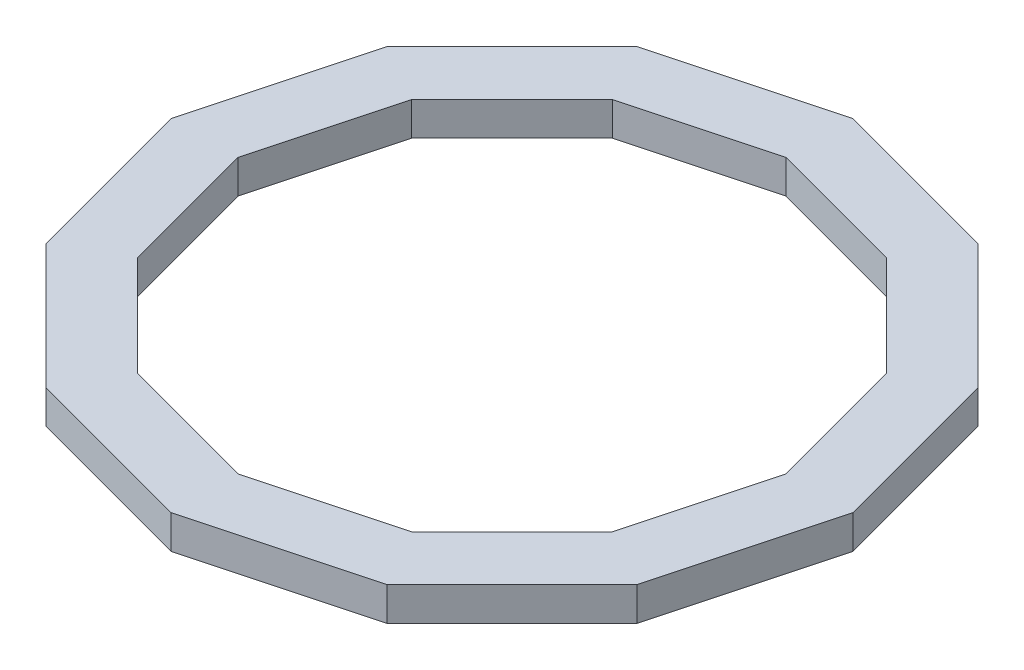
ISO-10303-21;
HEADER;
FILE_DESCRIPTION(('STEP AP214'),'2;1');
FILE_NAME('part.step','',(''),(''),'','','');
FILE_SCHEMA(('AUTOMOTIVE_DESIGN { 1 0 10303 214 1 1 1 1 }'));
ENDSEC;
DATA;
#1=APPLICATION_CONTEXT('core data for automotive mechanical design processes');
#2=APPLICATION_PROTOCOL_DEFINITION('international standard','automotive_design',2000,#1);
#3=PRODUCT_CONTEXT('',#1,'mechanical');
#4=PRODUCT('Part','Part','',(#3));
#5=PRODUCT_RELATED_PRODUCT_CATEGORY('part','',(#4));
#6=PRODUCT_DEFINITION_FORMATION('','',#4);
#7=PRODUCT_DEFINITION_CONTEXT('part definition',#1,'design');
#8=PRODUCT_DEFINITION('design','',#6,#7);
#9=PRODUCT_DEFINITION_SHAPE('','',#8);
#10=(LENGTH_UNIT() NAMED_UNIT(*) SI_UNIT(.MILLI.,.METRE.));
#11=(NAMED_UNIT(*) PLANE_ANGLE_UNIT() SI_UNIT($,.RADIAN.));
#12=(NAMED_UNIT(*) SI_UNIT($,.STERADIAN.) SOLID_ANGLE_UNIT());
#13=UNCERTAINTY_MEASURE_WITH_UNIT(LENGTH_MEASURE(1.E-05),#10,'distance_accuracy_value','');
#14=(GEOMETRIC_REPRESENTATION_CONTEXT(3) GLOBAL_UNCERTAINTY_ASSIGNED_CONTEXT((#13)) GLOBAL_UNIT_ASSIGNED_CONTEXT((#10,
#11,#12)) REPRESENTATION_CONTEXT('',''));
#15=CARTESIAN_POINT('',(0.,0.,0.));
#16=DIRECTION('',(0.,0.,1.));
#17=DIRECTION('',(1.,0.,0.));
#18=AXIS2_PLACEMENT_3D('',#15,#16,#17);
#19=CARTESIAN_POINT('',(0.,19.05,0.));
#20=DIRECTION('',(0.,1.,0.));
#21=DIRECTION('',(0.,0.,1.));
#22=AXIS2_PLACEMENT_3D('',#19,#20,#21);
#23=PLANE('',#22);
#24=DIRECTION('',(-0.258819045102521,0.,0.965925826289068));
#25=VECTOR('',#24,1.);
#26=CARTESIAN_POINT('',(-167.855361508028,19.05,-96.9113381515822));
#27=LINE('',#26,#25);
#28=CARTESIAN_POINT('',(-167.855361508028,19.05,-96.9113381515822));
#29=VERTEX_POINT('',#28);
#30=CARTESIAN_POINT('',(-193.822676303164,19.05,0.));
#31=VERTEX_POINT('',#30);
#32=EDGE_CURVE('E290',#29,#31,#27,.T.);
#33=ORIENTED_EDGE('',*,*,#32,.T.);
#34=DIRECTION('',(0.258819045102521,0.,0.965925826289068));
#35=VECTOR('',#34,1.);
#36=CARTESIAN_POINT('',(-193.822676303164,19.05,0.));
#37=LINE('',#36,#35);
#38=CARTESIAN_POINT('',(-167.855361508028,19.05,96.9113381515822));
#39=VERTEX_POINT('',#38);
#40=EDGE_CURVE('E294',#31,#39,#37,.T.);
#41=ORIENTED_EDGE('',*,*,#40,.T.);
#42=DIRECTION('',(0.707106781186547,0.,0.707106781186548));
#43=VECTOR('',#42,1.);
#44=CARTESIAN_POINT('',(-167.855361508028,19.05,96.9113381515822));
#45=LINE('',#44,#43);
#46=CARTESIAN_POINT('',(-96.9113381515822,19.05,167.855361508028));
#47=VERTEX_POINT('',#46);
#48=EDGE_CURVE('E297',#39,#47,#45,.T.);
#49=ORIENTED_EDGE('',*,*,#48,.T.);
#50=DIRECTION('',(0.965925826289068,0.,0.25881904510252));
#51=VECTOR('',#50,1.);
#52=CARTESIAN_POINT('',(-96.9113381515822,19.05,167.855361508028));
#53=LINE('',#52,#51);
#54=CARTESIAN_POINT('',(0.,19.05,193.822676303164));
#55=VERTEX_POINT('',#54);
#56=EDGE_CURVE('E299',#47,#55,#53,.T.);
#57=ORIENTED_EDGE('',*,*,#56,.T.);
#58=DIRECTION('',(0.965925826289068,0.,-0.258819045102521));
#59=VECTOR('',#58,1.);
#60=CARTESIAN_POINT('',(0.,19.05,193.822676303164));
#61=LINE('',#60,#59);
#62=CARTESIAN_POINT('',(96.9113381515822,19.05,167.855361508028));
#63=VERTEX_POINT('',#62);
#64=EDGE_CURVE('E301',#55,#63,#61,.T.);
#65=ORIENTED_EDGE('',*,*,#64,.T.);
#66=DIRECTION('',(0.707106781186547,0.,-0.707106781186548));
#67=VECTOR('',#66,1.);
#68=CARTESIAN_POINT('',(96.9113381515822,19.05,167.855361508028));
#69=LINE('',#68,#67);
#70=CARTESIAN_POINT('',(167.855361508028,19.05,96.9113381515822));
#71=VERTEX_POINT('',#70);
#72=EDGE_CURVE('E303',#63,#71,#69,.T.);
#73=ORIENTED_EDGE('',*,*,#72,.T.);
#74=DIRECTION('',(0.258819045102521,0.,-0.965925826289068));
#75=VECTOR('',#74,1.);
#76=CARTESIAN_POINT('',(167.855361508028,19.05,96.9113381515822));
#77=LINE('',#76,#75);
#78=CARTESIAN_POINT('',(193.822676303164,19.05,0.));
#79=VERTEX_POINT('',#78);
#80=EDGE_CURVE('E305',#71,#79,#77,.T.);
#81=ORIENTED_EDGE('',*,*,#80,.T.);
#82=DIRECTION('',(-0.258819045102521,0.,-0.965925826289068));
#83=VECTOR('',#82,1.);
#84=CARTESIAN_POINT('',(193.822676303164,19.05,0.));
#85=LINE('',#84,#83);
#86=CARTESIAN_POINT('',(167.855361508028,19.05,-96.9113381515821));
#87=VERTEX_POINT('',#86);
#88=EDGE_CURVE('E307',#79,#87,#85,.T.);
#89=ORIENTED_EDGE('',*,*,#88,.T.);
#90=DIRECTION('',(-0.707106781186547,0.,-0.707106781186548));
#91=VECTOR('',#90,1.);
#92=CARTESIAN_POINT('',(167.855361508028,19.05,-96.9113381515821));
#93=LINE('',#92,#91);
#94=CARTESIAN_POINT('',(96.9113381515819,19.05,-167.855361508029));
#95=VERTEX_POINT('',#94);
#96=EDGE_CURVE('E309',#87,#95,#93,.T.);
#97=ORIENTED_EDGE('',*,*,#96,.T.);
#98=DIRECTION('',(-0.965925826289068,0.,-0.258819045102521));
#99=VECTOR('',#98,1.);
#100=CARTESIAN_POINT('',(96.9113381515819,19.05,-167.855361508029));
#101=LINE('',#100,#99);
#102=CARTESIAN_POINT('',(0.,19.05,-193.822676303164));
#103=VERTEX_POINT('',#102);
#104=EDGE_CURVE('E311',#95,#103,#101,.T.);
#105=ORIENTED_EDGE('',*,*,#104,.T.);
#106=DIRECTION('',(-0.965925826289068,0.,0.258819045102521));
#107=VECTOR('',#106,1.);
#108=CARTESIAN_POINT('',(0.,19.05,-193.822676303164));
#109=LINE('',#108,#107);
#110=CARTESIAN_POINT('',(-96.9113381515821,19.05,-167.855361508029));
#111=VERTEX_POINT('',#110);
#112=EDGE_CURVE('E313',#103,#111,#109,.T.);
#113=ORIENTED_EDGE('',*,*,#112,.T.);
#114=DIRECTION('',(-0.707106781186548,0.,0.707106781186547));
#115=VECTOR('',#114,1.);
#116=CARTESIAN_POINT('',(-96.9113381515821,19.05,-167.855361508029));
#117=LINE('',#116,#115);
#118=EDGE_CURVE('E315',#111,#29,#117,.T.);
#119=ORIENTED_EDGE('',*,*,#118,.T.);
#120=EDGE_LOOP('',(#33,#41,#49,#57,#65,#73,#81,#89,#97,#105,#113,#119));
#121=FACE_BOUND('',#120,.T.);
#122=DIRECTION('',(0.25881904510252,0.,0.965925826289068));
#123=VECTOR('',#122,1.);
#124=CARTESIAN_POINT('',(-155.693454578661,19.05,0.));
#125=LINE('',#124,#123);
#126=CARTESIAN_POINT('',(-155.693454578661,19.05,0.));
#127=VERTEX_POINT('',#126);
#128=CARTESIAN_POINT('',(-134.834486868079,19.05,77.8467272893304));
#129=VERTEX_POINT('',#128);
#130=EDGE_CURVE('E204',#127,#129,#125,.T.);
#131=ORIENTED_EDGE('',*,*,#130,.F.);
#132=DIRECTION('',(-0.258819045102521,0.,0.965925826289068));
#133=VECTOR('',#132,1.);
#134=CARTESIAN_POINT('',(-134.834486868079,19.05,-77.8467272893304));
#135=LINE('',#134,#133);
#136=CARTESIAN_POINT('',(-134.834486868079,19.05,-77.8467272893304));
#137=VERTEX_POINT('',#136);
#138=EDGE_CURVE('E196',#137,#127,#135,.T.);
#139=ORIENTED_EDGE('',*,*,#138,.F.);
#140=DIRECTION('',(-0.707106781186548,0.,0.707106781186547));
#141=VECTOR('',#140,1.);
#142=CARTESIAN_POINT('',(-77.8467272893303,19.05,-134.834486868079));
#143=LINE('',#142,#141);
#144=CARTESIAN_POINT('',(-77.8467272893303,19.05,-134.834486868079));
#145=VERTEX_POINT('',#144);
#146=EDGE_CURVE('E237',#145,#137,#143,.T.);
#147=ORIENTED_EDGE('',*,*,#146,.F.);
#148=DIRECTION('',(-0.965925826289068,0.,0.25881904510252));
#149=VECTOR('',#148,1.);
#150=CARTESIAN_POINT('',(1.11608000320187E-13,19.05,-155.693454578661));
#151=LINE('',#150,#149);
#152=CARTESIAN_POINT('',(1.11608000320187E-13,19.05,-155.693454578661));
#153=VERTEX_POINT('',#152);
#154=EDGE_CURVE('E235',#153,#145,#151,.T.);
#155=ORIENTED_EDGE('',*,*,#154,.F.);
#156=DIRECTION('',(-0.965925826289068,0.,-0.258819045102521));
#157=VECTOR('',#156,1.);
#158=CARTESIAN_POINT('',(77.8467272893306,19.05,-134.834486868079));
#159=LINE('',#158,#157);
#160=CARTESIAN_POINT('',(77.8467272893306,19.05,-134.834486868079));
#161=VERTEX_POINT('',#160);
#162=EDGE_CURVE('E233',#161,#153,#159,.T.);
#163=ORIENTED_EDGE('',*,*,#162,.F.);
#164=DIRECTION('',(-0.707106781186547,0.,-0.707106781186548));
#165=VECTOR('',#164,1.);
#166=CARTESIAN_POINT('',(134.834486868079,19.05,-77.8467272893304));
#167=LINE('',#166,#165);
#168=CARTESIAN_POINT('',(134.834486868079,19.05,-77.8467272893304));
#169=VERTEX_POINT('',#168);
#170=EDGE_CURVE('E231',#169,#161,#167,.T.);
#171=ORIENTED_EDGE('',*,*,#170,.F.);
#172=DIRECTION('',(-0.258819045102521,0.,-0.965925826289068));
#173=VECTOR('',#172,1.);
#174=CARTESIAN_POINT('',(155.693454578661,19.05,1.72477816094025E-13));
#175=LINE('',#174,#173);
#176=CARTESIAN_POINT('',(155.693454578661,19.05,1.72477816094025E-13));
#177=VERTEX_POINT('',#176);
#178=EDGE_CURVE('E229',#177,#169,#175,.T.);
#179=ORIENTED_EDGE('',*,*,#178,.F.);
#180=DIRECTION('',(0.258819045102522,0.,-0.965925826289068));
#181=VECTOR('',#180,1.);
#182=CARTESIAN_POINT('',(134.834486868079,19.05,77.8467272893304));
#183=LINE('',#182,#181);
#184=CARTESIAN_POINT('',(134.834486868079,19.05,77.8467272893304));
#185=VERTEX_POINT('',#184);
#186=EDGE_CURVE('E227',#185,#177,#183,.T.);
#187=ORIENTED_EDGE('',*,*,#186,.F.);
#188=DIRECTION('',(0.707106781186548,0.,-0.707106781186547));
#189=VECTOR('',#188,1.);
#190=CARTESIAN_POINT('',(77.8467272893305,19.05,134.834486868079));
#191=LINE('',#190,#189);
#192=CARTESIAN_POINT('',(77.8467272893305,19.05,134.834486868079));
#193=VERTEX_POINT('',#192);
#194=EDGE_CURVE('E225',#193,#185,#191,.T.);
#195=ORIENTED_EDGE('',*,*,#194,.F.);
#196=DIRECTION('',(0.965925826289068,0.,-0.258819045102521));
#197=VECTOR('',#196,1.);
#198=CARTESIAN_POINT('',(-1.22547225990368E-13,19.05,155.693454578661));
#199=LINE('',#198,#197);
#200=CARTESIAN_POINT('',(-1.22547225990368E-13,19.05,155.693454578661));
#201=VERTEX_POINT('',#200);
#202=EDGE_CURVE('E223',#201,#193,#199,.T.);
#203=ORIENTED_EDGE('',*,*,#202,.F.);
#204=DIRECTION('',(0.965925826289068,0.,0.258819045102521));
#205=VECTOR('',#204,1.);
#206=CARTESIAN_POINT('',(-77.8467272893304,19.05,134.834486868079));
#207=LINE('',#206,#205);
#208=CARTESIAN_POINT('',(-77.8467272893304,19.05,134.834486868079));
#209=VERTEX_POINT('',#208);
#210=EDGE_CURVE('E219',#209,#201,#207,.T.);
#211=ORIENTED_EDGE('',*,*,#210,.F.);
#212=DIRECTION('',(0.707106781186547,0.,0.707106781186548));
#213=VECTOR('',#212,1.);
#214=CARTESIAN_POINT('',(-134.834486868079,19.05,77.8467272893304));
#215=LINE('',#214,#213);
#216=EDGE_CURVE('E217',#129,#209,#215,.T.);
#217=ORIENTED_EDGE('',*,*,#216,.F.);
#218=EDGE_LOOP('',(#131,#139,#147,#155,#163,#171,#179,#187,#195,#203,#211,#217));
#219=FACE_BOUND('',#218,.T.);
#220=ADVANCED_FACE('F35',(#121,#219),#23,.T.);
#221=CARTESIAN_POINT('',(0.,0.,0.));
#222=DIRECTION('',(0.,1.,0.));
#223=DIRECTION('',(0.,0.,1.));
#224=AXIS2_PLACEMENT_3D('',#221,#222,#223);
#225=PLANE('',#224);
#226=DIRECTION('',(-0.258819045102521,0.,0.965925826289068));
#227=VECTOR('',#226,1.);
#228=CARTESIAN_POINT('',(-167.855361508028,0.,-96.9113381515822));
#229=LINE('',#228,#227);
#230=CARTESIAN_POINT('',(-167.855361508028,0.,-96.9113381515822));
#231=VERTEX_POINT('',#230);
#232=CARTESIAN_POINT('',(-193.822676303164,0.,0.));
#233=VERTEX_POINT('',#232);
#234=EDGE_CURVE('E212',#231,#233,#229,.T.);
#235=ORIENTED_EDGE('',*,*,#234,.F.);
#236=DIRECTION('',(-0.707106781186548,0.,0.707106781186547));
#237=VECTOR('',#236,1.);
#238=CARTESIAN_POINT('',(-96.9113381515821,0.,-167.855361508029));
#239=LINE('',#238,#237);
#240=CARTESIAN_POINT('',(-96.9113381515821,0.,-167.855361508029));
#241=VERTEX_POINT('',#240);
#242=EDGE_CURVE('E295',#241,#231,#239,.T.);
#243=ORIENTED_EDGE('',*,*,#242,.F.);
#244=DIRECTION('',(-0.965925826289068,0.,0.258819045102521));
#245=VECTOR('',#244,1.);
#246=CARTESIAN_POINT('',(0.,0.,-193.822676303164));
#247=LINE('',#246,#245);
#248=CARTESIAN_POINT('',(0.,0.,-193.822676303164));
#249=VERTEX_POINT('',#248);
#250=EDGE_CURVE('E339',#249,#241,#247,.T.);
#251=ORIENTED_EDGE('',*,*,#250,.F.);
#252=DIRECTION('',(-0.965925826289068,0.,-0.258819045102521));
#253=VECTOR('',#252,1.);
#254=CARTESIAN_POINT('',(96.9113381515819,0.,-167.855361508029));
#255=LINE('',#254,#253);
#256=CARTESIAN_POINT('',(96.9113381515819,0.,-167.855361508029));
#257=VERTEX_POINT('',#256);
#258=EDGE_CURVE('E337',#257,#249,#255,.T.);
#259=ORIENTED_EDGE('',*,*,#258,.F.);
#260=DIRECTION('',(-0.707106781186547,0.,-0.707106781186548));
#261=VECTOR('',#260,1.);
#262=CARTESIAN_POINT('',(167.855361508028,0.,-96.9113381515821));
#263=LINE('',#262,#261);
#264=CARTESIAN_POINT('',(167.855361508028,0.,-96.9113381515821));
#265=VERTEX_POINT('',#264);
#266=EDGE_CURVE('E335',#265,#257,#263,.T.);
#267=ORIENTED_EDGE('',*,*,#266,.F.);
#268=DIRECTION('',(-0.258819045102521,0.,-0.965925826289068));
#269=VECTOR('',#268,1.);
#270=CARTESIAN_POINT('',(193.822676303164,0.,0.));
#271=LINE('',#270,#269);
#272=CARTESIAN_POINT('',(193.822676303164,0.,0.));
#273=VERTEX_POINT('',#272);
#274=EDGE_CURVE('E333',#273,#265,#271,.T.);
#275=ORIENTED_EDGE('',*,*,#274,.F.);
#276=DIRECTION('',(0.258819045102521,0.,-0.965925826289068));
#277=VECTOR('',#276,1.);
#278=CARTESIAN_POINT('',(167.855361508028,0.,96.9113381515822));
#279=LINE('',#278,#277);
#280=CARTESIAN_POINT('',(167.855361508028,0.,96.9113381515822));
#281=VERTEX_POINT('',#280);
#282=EDGE_CURVE('E331',#281,#273,#279,.T.);
#283=ORIENTED_EDGE('',*,*,#282,.F.);
#284=DIRECTION('',(0.707106781186547,0.,-0.707106781186548));
#285=VECTOR('',#284,1.);
#286=CARTESIAN_POINT('',(96.9113381515822,0.,167.855361508028));
#287=LINE('',#286,#285);
#288=CARTESIAN_POINT('',(96.9113381515822,0.,167.855361508028));
#289=VERTEX_POINT('',#288);
#290=EDGE_CURVE('E329',#289,#281,#287,.T.);
#291=ORIENTED_EDGE('',*,*,#290,.F.);
#292=DIRECTION('',(0.965925826289068,0.,-0.258819045102521));
#293=VECTOR('',#292,1.);
#294=CARTESIAN_POINT('',(0.,0.,193.822676303164));
#295=LINE('',#294,#293);
#296=CARTESIAN_POINT('',(0.,0.,193.822676303164));
#297=VERTEX_POINT('',#296);
#298=EDGE_CURVE('E327',#297,#289,#295,.T.);
#299=ORIENTED_EDGE('',*,*,#298,.F.);
#300=DIRECTION('',(0.965925826289068,0.,0.25881904510252));
#301=VECTOR('',#300,1.);
#302=CARTESIAN_POINT('',(-96.9113381515822,0.,167.855361508028));
#303=LINE('',#302,#301);
#304=CARTESIAN_POINT('',(-96.9113381515822,0.,167.855361508028));
#305=VERTEX_POINT('',#304);
#306=EDGE_CURVE('E325',#305,#297,#303,.T.);
#307=ORIENTED_EDGE('',*,*,#306,.F.);
#308=DIRECTION('',(0.707106781186547,0.,0.707106781186548));
#309=VECTOR('',#308,1.);
#310=CARTESIAN_POINT('',(-167.855361508028,0.,96.9113381515822));
#311=LINE('',#310,#309);
#312=CARTESIAN_POINT('',(-167.855361508028,0.,96.9113381515822));
#313=VERTEX_POINT('',#312);
#314=EDGE_CURVE('E323',#313,#305,#311,.T.);
#315=ORIENTED_EDGE('',*,*,#314,.F.);
#316=DIRECTION('',(0.258819045102521,0.,0.965925826289068));
#317=VECTOR('',#316,1.);
#318=CARTESIAN_POINT('',(-193.822676303164,0.,0.));
#319=LINE('',#318,#317);
#320=EDGE_CURVE('E321',#233,#313,#319,.T.);
#321=ORIENTED_EDGE('',*,*,#320,.F.);
#322=EDGE_LOOP('',(#235,#243,#251,#259,#267,#275,#283,#291,#299,#307,#315,#321));
#323=FACE_BOUND('',#322,.T.);
#324=DIRECTION('',(-0.258819045102521,0.,0.965925826289068));
#325=VECTOR('',#324,1.);
#326=CARTESIAN_POINT('',(-134.834486868079,0.,-77.8467272893304));
#327=LINE('',#326,#325);
#328=CARTESIAN_POINT('',(-134.834486868079,0.,-77.8467272893304));
#329=VERTEX_POINT('',#328);
#330=CARTESIAN_POINT('',(-155.693454578661,0.,0.));
#331=VERTEX_POINT('',#330);
#332=EDGE_CURVE('E58',#329,#331,#327,.T.);
#333=ORIENTED_EDGE('',*,*,#332,.T.);
#334=DIRECTION('',(0.25881904510252,0.,0.965925826289068));
#335=VECTOR('',#334,1.);
#336=CARTESIAN_POINT('',(-155.693454578661,0.,0.));
#337=LINE('',#336,#335);
#338=CARTESIAN_POINT('',(-134.834486868079,0.,77.8467272893304));
#339=VERTEX_POINT('',#338);
#340=EDGE_CURVE('E211',#331,#339,#337,.T.);
#341=ORIENTED_EDGE('',*,*,#340,.T.);
#342=DIRECTION('',(0.707106781186547,0.,0.707106781186548));
#343=VECTOR('',#342,1.);
#344=CARTESIAN_POINT('',(-134.834486868079,0.,77.8467272893304));
#345=LINE('',#344,#343);
#346=CARTESIAN_POINT('',(-77.8467272893304,0.,134.834486868079));
#347=VERTEX_POINT('',#346);
#348=EDGE_CURVE('E241',#339,#347,#345,.T.);
#349=ORIENTED_EDGE('',*,*,#348,.T.);
#350=DIRECTION('',(0.965925826289068,0.,0.258819045102521));
#351=VECTOR('',#350,1.);
#352=CARTESIAN_POINT('',(-77.8467272893304,0.,134.834486868079));
#353=LINE('',#352,#351);
#354=CARTESIAN_POINT('',(-1.22547225990368E-13,0.,155.693454578661));
#355=VERTEX_POINT('',#354);
#356=EDGE_CURVE('E244',#347,#355,#353,.T.);
#357=ORIENTED_EDGE('',*,*,#356,.T.);
#358=DIRECTION('',(0.965925826289068,0.,-0.258819045102521));
#359=VECTOR('',#358,1.);
#360=CARTESIAN_POINT('',(-1.22547225990368E-13,0.,155.693454578661));
#361=LINE('',#360,#359);
#362=CARTESIAN_POINT('',(77.8467272893305,0.,134.834486868079));
#363=VERTEX_POINT('',#362);
#364=EDGE_CURVE('E247',#355,#363,#361,.T.);
#365=ORIENTED_EDGE('',*,*,#364,.T.);
#366=DIRECTION('',(0.707106781186548,0.,-0.707106781186547));
#367=VECTOR('',#366,1.);
#368=CARTESIAN_POINT('',(77.8467272893305,0.,134.834486868079));
#369=LINE('',#368,#367);
#370=CARTESIAN_POINT('',(134.834486868079,0.,77.8467272893304));
#371=VERTEX_POINT('',#370);
#372=EDGE_CURVE('E250',#363,#371,#369,.T.);
#373=ORIENTED_EDGE('',*,*,#372,.T.);
#374=DIRECTION('',(0.258819045102522,0.,-0.965925826289068));
#375=VECTOR('',#374,1.);
#376=CARTESIAN_POINT('',(134.834486868079,0.,77.8467272893304));
#377=LINE('',#376,#375);
#378=CARTESIAN_POINT('',(155.693454578661,0.,1.72477816094025E-13));
#379=VERTEX_POINT('',#378);
#380=EDGE_CURVE('E253',#371,#379,#377,.T.);
#381=ORIENTED_EDGE('',*,*,#380,.T.);
#382=DIRECTION('',(-0.258819045102521,0.,-0.965925826289068));
#383=VECTOR('',#382,1.);
#384=CARTESIAN_POINT('',(155.693454578661,0.,1.72477816094025E-13));
#385=LINE('',#384,#383);
#386=CARTESIAN_POINT('',(134.834486868079,0.,-77.8467272893304));
#387=VERTEX_POINT('',#386);
#388=EDGE_CURVE('E256',#379,#387,#385,.T.);
#389=ORIENTED_EDGE('',*,*,#388,.T.);
#390=DIRECTION('',(-0.707106781186547,0.,-0.707106781186548));
#391=VECTOR('',#390,1.);
#392=CARTESIAN_POINT('',(134.834486868079,0.,-77.8467272893304));
#393=LINE('',#392,#391);
#394=CARTESIAN_POINT('',(77.8467272893306,0.,-134.834486868079));
#395=VERTEX_POINT('',#394);
#396=EDGE_CURVE('E259',#387,#395,#393,.T.);
#397=ORIENTED_EDGE('',*,*,#396,.T.);
#398=DIRECTION('',(-0.965925826289068,0.,-0.258819045102521));
#399=VECTOR('',#398,1.);
#400=CARTESIAN_POINT('',(77.8467272893306,0.,-134.834486868079));
#401=LINE('',#400,#399);
#402=CARTESIAN_POINT('',(1.11608000320187E-13,0.,-155.693454578661));
#403=VERTEX_POINT('',#402);
#404=EDGE_CURVE('E262',#395,#403,#401,.T.);
#405=ORIENTED_EDGE('',*,*,#404,.T.);
#406=DIRECTION('',(-0.965925826289068,0.,0.25881904510252));
#407=VECTOR('',#406,1.);
#408=CARTESIAN_POINT('',(1.11608000320187E-13,0.,-155.693454578661));
#409=LINE('',#408,#407);
#410=CARTESIAN_POINT('',(-77.8467272893303,0.,-134.834486868079));
#411=VERTEX_POINT('',#410);
#412=EDGE_CURVE('E265',#403,#411,#409,.T.);
#413=ORIENTED_EDGE('',*,*,#412,.T.);
#414=DIRECTION('',(-0.707106781186548,0.,0.707106781186547));
#415=VECTOR('',#414,1.);
#416=CARTESIAN_POINT('',(-77.8467272893303,0.,-134.834486868079));
#417=LINE('',#416,#415);
#418=EDGE_CURVE('E205',#411,#329,#417,.T.);
#419=ORIENTED_EDGE('',*,*,#418,.T.);
#420=EDGE_LOOP('',(#333,#341,#349,#357,#365,#373,#381,#389,#397,#405,#413,#419));
#421=FACE_BOUND('',#420,.T.);
#422=ADVANCED_FACE('F382',(#323,#421),#225,.F.);
#423=CARTESIAN_POINT('',(-167.855361508028,19.05,-96.9113381515822));
#424=DIRECTION('',(0.965925826289068,0.,0.258819045102521));
#425=DIRECTION('',(0.258819045102521,0.,-0.965925826289068));
#426=AXIS2_PLACEMENT_3D('',#423,#424,#425);
#427=PLANE('',#426);
#428=ORIENTED_EDGE('',*,*,#234,.T.);
#429=DIRECTION('',(0.,-1.,0.));
#430=VECTOR('',#429,1.);
#431=CARTESIAN_POINT('',(-193.822676303164,19.05,0.));
#432=LINE('',#431,#430);
#433=EDGE_CURVE('E11',#31,#233,#432,.T.);
#434=ORIENTED_EDGE('',*,*,#433,.F.);
#435=ORIENTED_EDGE('',*,*,#32,.F.);
#436=DIRECTION('',(0.,-1.,0.));
#437=VECTOR('',#436,1.);
#438=CARTESIAN_POINT('',(-167.855361508028,19.05,-96.9113381515822));
#439=LINE('',#438,#437);
#440=EDGE_CURVE('E317',#29,#231,#439,.T.);
#441=ORIENTED_EDGE('',*,*,#440,.T.);
#442=EDGE_LOOP('',(#428,#434,#435,#441));
#443=FACE_BOUND('',#442,.T.);
#444=ADVANCED_FACE('F37',(#443),#427,.F.);
#445=CARTESIAN_POINT('',(-193.822676303164,19.05,0.));
#446=DIRECTION('',(0.965925826289068,0.,-0.258819045102521));
#447=DIRECTION('',(-0.258819045102521,0.,-0.965925826289068));
#448=AXIS2_PLACEMENT_3D('',#445,#446,#447);
#449=PLANE('',#448);
#450=ORIENTED_EDGE('',*,*,#320,.T.);
#451=DIRECTION('',(0.,-1.,0.));
#452=VECTOR('',#451,1.);
#453=CARTESIAN_POINT('',(-167.855361508028,19.05,96.9113381515822));
#454=LINE('',#453,#452);
#455=EDGE_CURVE('E43',#39,#313,#454,.T.);
#456=ORIENTED_EDGE('',*,*,#455,.F.);
#457=ORIENTED_EDGE('',*,*,#40,.F.);
#458=ORIENTED_EDGE('',*,*,#433,.T.);
#459=EDGE_LOOP('',(#450,#456,#457,#458));
#460=FACE_BOUND('',#459,.T.);
#461=ADVANCED_FACE('F399',(#460),#449,.F.);
#462=CARTESIAN_POINT('',(-167.855361508028,19.05,96.9113381515822));
#463=DIRECTION('',(0.707106781186548,0.,-0.707106781186547));
#464=DIRECTION('',(-0.707106781186547,0.,-0.707106781186548));
#465=AXIS2_PLACEMENT_3D('',#462,#463,#464);
#466=PLANE('',#465);
#467=ORIENTED_EDGE('',*,*,#314,.T.);
#468=DIRECTION('',(0.,-1.,0.));
#469=VECTOR('',#468,1.);
#470=CARTESIAN_POINT('',(-96.9113381515822,19.05,167.855361508028));
#471=LINE('',#470,#469);
#472=EDGE_CURVE('E369',#47,#305,#471,.T.);
#473=ORIENTED_EDGE('',*,*,#472,.F.);
#474=ORIENTED_EDGE('',*,*,#48,.F.);
#475=ORIENTED_EDGE('',*,*,#455,.T.);
#476=EDGE_LOOP('',(#467,#473,#474,#475));
#477=FACE_BOUND('',#476,.T.);
#478=ADVANCED_FACE('F376',(#477),#466,.F.);
#479=CARTESIAN_POINT('',(-96.9113381515822,19.05,167.855361508028));
#480=DIRECTION('',(0.25881904510252,0.,-0.965925826289068));
#481=DIRECTION('',(-0.965925826289069,0.,-0.25881904510252));
#482=AXIS2_PLACEMENT_3D('',#479,#480,#481);
#483=PLANE('',#482);
#484=ORIENTED_EDGE('',*,*,#306,.T.);
#485=DIRECTION('',(0.,-1.,0.));
#486=VECTOR('',#485,1.);
#487=CARTESIAN_POINT('',(0.,19.05,193.822676303164));
#488=LINE('',#487,#486);
#489=EDGE_CURVE('E366',#55,#297,#488,.T.);
#490=ORIENTED_EDGE('',*,*,#489,.F.);
#491=ORIENTED_EDGE('',*,*,#56,.F.);
#492=ORIENTED_EDGE('',*,*,#472,.T.);
#493=EDGE_LOOP('',(#484,#490,#491,#492));
#494=FACE_BOUND('',#493,.T.);
#495=ADVANCED_FACE('F388',(#494),#483,.F.);
#496=CARTESIAN_POINT('',(0.,19.05,193.822676303164));
#497=DIRECTION('',(-0.258819045102521,0.,-0.965925826289068));
#498=DIRECTION('',(-0.965925826289068,0.,0.258819045102521));
#499=AXIS2_PLACEMENT_3D('',#496,#497,#498);
#500=PLANE('',#499);
#501=ORIENTED_EDGE('',*,*,#298,.T.);
#502=DIRECTION('',(0.,-1.,0.));
#503=VECTOR('',#502,1.);
#504=CARTESIAN_POINT('',(96.9113381515822,19.05,167.855361508028));
#505=LINE('',#504,#503);
#506=EDGE_CURVE('E363',#63,#289,#505,.T.);
#507=ORIENTED_EDGE('',*,*,#506,.F.);
#508=ORIENTED_EDGE('',*,*,#64,.F.);
#509=ORIENTED_EDGE('',*,*,#489,.T.);
#510=EDGE_LOOP('',(#501,#507,#508,#509));
#511=FACE_BOUND('',#510,.T.);
#512=ADVANCED_FACE('F392',(#511),#500,.F.);
#513=CARTESIAN_POINT('',(96.9113381515822,19.05,167.855361508028));
#514=DIRECTION('',(-0.707106781186548,0.,-0.707106781186547));
#515=DIRECTION('',(-0.707106781186547,0.,0.707106781186548));
#516=AXIS2_PLACEMENT_3D('',#513,#514,#515);
#517=PLANE('',#516);
#518=ORIENTED_EDGE('',*,*,#290,.T.);
#519=DIRECTION('',(0.,-1.,0.));
#520=VECTOR('',#519,1.);
#521=CARTESIAN_POINT('',(167.855361508028,19.05,96.9113381515822));
#522=LINE('',#521,#520);
#523=EDGE_CURVE('E360',#71,#281,#522,.T.);
#524=ORIENTED_EDGE('',*,*,#523,.F.);
#525=ORIENTED_EDGE('',*,*,#72,.F.);
#526=ORIENTED_EDGE('',*,*,#506,.T.);
#527=EDGE_LOOP('',(#518,#524,#525,#526));
#528=FACE_BOUND('',#527,.T.);
#529=ADVANCED_FACE('F432',(#528),#517,.F.);
#530=CARTESIAN_POINT('',(167.855361508028,19.05,96.9113381515822));
#531=DIRECTION('',(-0.965925826289068,0.,-0.258819045102521));
#532=DIRECTION('',(-0.258819045102521,0.,0.965925826289068));
#533=AXIS2_PLACEMENT_3D('',#530,#531,#532);
#534=PLANE('',#533);
#535=ORIENTED_EDGE('',*,*,#282,.T.);
#536=DIRECTION('',(0.,-1.,0.));
#537=VECTOR('',#536,1.);
#538=CARTESIAN_POINT('',(193.822676303164,19.05,0.));
#539=LINE('',#538,#537);
#540=EDGE_CURVE('E357',#79,#273,#539,.T.);
#541=ORIENTED_EDGE('',*,*,#540,.F.);
#542=ORIENTED_EDGE('',*,*,#80,.F.);
#543=ORIENTED_EDGE('',*,*,#523,.T.);
#544=EDGE_LOOP('',(#535,#541,#542,#543));
#545=FACE_BOUND('',#544,.T.);
#546=ADVANCED_FACE('F430',(#545),#534,.F.);
#547=CARTESIAN_POINT('',(193.822676303164,19.05,0.));
#548=DIRECTION('',(-0.965925826289068,0.,0.258819045102521));
#549=DIRECTION('',(0.258819045102521,0.,0.965925826289068));
#550=AXIS2_PLACEMENT_3D('',#547,#548,#549);
#551=PLANE('',#550);
#552=ORIENTED_EDGE('',*,*,#274,.T.);
#553=DIRECTION('',(0.,-1.,0.));
#554=VECTOR('',#553,1.);
#555=CARTESIAN_POINT('',(167.855361508028,19.05,-96.9113381515821));
#556=LINE('',#555,#554);
#557=EDGE_CURVE('E354',#87,#265,#556,.T.);
#558=ORIENTED_EDGE('',*,*,#557,.F.);
#559=ORIENTED_EDGE('',*,*,#88,.F.);
#560=ORIENTED_EDGE('',*,*,#540,.T.);
#561=EDGE_LOOP('',(#552,#558,#559,#560));
#562=FACE_BOUND('',#561,.T.);
#563=ADVANCED_FACE('F426',(#562),#551,.F.);
#564=CARTESIAN_POINT('',(167.855361508028,19.05,-96.9113381515821));
#565=DIRECTION('',(-0.707106781186548,0.,0.707106781186547));
#566=DIRECTION('',(0.707106781186547,0.,0.707106781186548));
#567=AXIS2_PLACEMENT_3D('',#564,#565,#566);
#568=PLANE('',#567);
#569=ORIENTED_EDGE('',*,*,#266,.T.);
#570=DIRECTION('',(0.,-1.,0.));
#571=VECTOR('',#570,1.);
#572=CARTESIAN_POINT('',(96.9113381515819,19.05,-167.855361508029));
#573=LINE('',#572,#571);
#574=EDGE_CURVE('E350',#95,#257,#573,.T.);
#575=ORIENTED_EDGE('',*,*,#574,.F.);
#576=ORIENTED_EDGE('',*,*,#96,.F.);
#577=ORIENTED_EDGE('',*,*,#557,.T.);
#578=EDGE_LOOP('',(#569,#575,#576,#577));
#579=FACE_BOUND('',#578,.T.);
#580=ADVANCED_FACE('F421',(#579),#568,.F.);
#581=CARTESIAN_POINT('',(96.9113381515819,19.05,-167.855361508029));
#582=DIRECTION('',(-0.258819045102521,0.,0.965925826289068));
#583=DIRECTION('',(0.965925826289068,0.,0.258819045102521));
#584=AXIS2_PLACEMENT_3D('',#581,#582,#583);
#585=PLANE('',#584);
#586=ORIENTED_EDGE('',*,*,#258,.T.);
#587=DIRECTION('',(0.,-1.,0.));
#588=VECTOR('',#587,1.);
#589=CARTESIAN_POINT('',(0.,19.05,-193.822676303164));
#590=LINE('',#589,#588);
#591=EDGE_CURVE('E347',#103,#249,#590,.T.);
#592=ORIENTED_EDGE('',*,*,#591,.F.);
#593=ORIENTED_EDGE('',*,*,#104,.F.);
#594=ORIENTED_EDGE('',*,*,#574,.T.);
#595=EDGE_LOOP('',(#586,#592,#593,#594));
#596=FACE_BOUND('',#595,.T.);
#597=ADVANCED_FACE('F415',(#596),#585,.F.);
#598=CARTESIAN_POINT('',(0.,19.05,-193.822676303164));
#599=DIRECTION('',(0.258819045102521,0.,0.965925826289068));
#600=DIRECTION('',(0.965925826289068,0.,-0.258819045102521));
#601=AXIS2_PLACEMENT_3D('',#598,#599,#600);
#602=PLANE('',#601);
#603=ORIENTED_EDGE('',*,*,#250,.T.);
#604=DIRECTION('',(0.,-1.,0.));
#605=VECTOR('',#604,1.);
#606=CARTESIAN_POINT('',(-96.9113381515821,19.05,-167.855361508029));
#607=LINE('',#606,#605);
#608=EDGE_CURVE('E344',#111,#241,#607,.T.);
#609=ORIENTED_EDGE('',*,*,#608,.F.);
#610=ORIENTED_EDGE('',*,*,#112,.F.);
#611=ORIENTED_EDGE('',*,*,#591,.T.);
#612=EDGE_LOOP('',(#603,#609,#610,#611));
#613=FACE_BOUND('',#612,.T.);
#614=ADVANCED_FACE('F411',(#613),#602,.F.);
#615=CARTESIAN_POINT('',(-96.9113381515821,19.05,-167.855361508029));
#616=DIRECTION('',(0.707106781186547,0.,0.707106781186548));
#617=DIRECTION('',(0.707106781186548,0.,-0.707106781186547));
#618=AXIS2_PLACEMENT_3D('',#615,#616,#617);
#619=PLANE('',#618);
#620=ORIENTED_EDGE('',*,*,#242,.T.);
#621=ORIENTED_EDGE('',*,*,#440,.F.);
#622=ORIENTED_EDGE('',*,*,#118,.F.);
#623=ORIENTED_EDGE('',*,*,#608,.T.);
#624=EDGE_LOOP('',(#620,#621,#622,#623));
#625=FACE_BOUND('',#624,.T.);
#626=ADVANCED_FACE('F406',(#625),#619,.F.);
#627=CARTESIAN_POINT('',(-134.834486868079,19.05,-77.8467272893304));
#628=DIRECTION('',(0.965925826289068,0.,0.258819045102521));
#629=DIRECTION('',(0.258819045102521,0.,-0.965925826289068));
#630=AXIS2_PLACEMENT_3D('',#627,#628,#629);
#631=PLANE('',#630);
#632=ORIENTED_EDGE('',*,*,#332,.F.);
#633=DIRECTION('',(0.,-1.,0.));
#634=VECTOR('',#633,1.);
#635=CARTESIAN_POINT('',(-134.834486868079,19.05,-77.8467272893304));
#636=LINE('',#635,#634);
#637=EDGE_CURVE('E200',#137,#329,#636,.T.);
#638=ORIENTED_EDGE('',*,*,#637,.F.);
#639=ORIENTED_EDGE('',*,*,#138,.T.);
#640=DIRECTION('',(0.,-1.,0.));
#641=VECTOR('',#640,1.);
#642=CARTESIAN_POINT('',(-155.693454578661,19.05,0.));
#643=LINE('',#642,#641);
#644=EDGE_CURVE('E199',#127,#331,#643,.T.);
#645=ORIENTED_EDGE('',*,*,#644,.T.);
#646=EDGE_LOOP('',(#632,#638,#639,#645));
#647=FACE_BOUND('',#646,.T.);
#648=ADVANCED_FACE('F198',(#647),#631,.T.);
#649=CARTESIAN_POINT('',(-155.693454578661,19.05,0.));
#650=DIRECTION('',(0.965925826289068,0.,-0.25881904510252));
#651=DIRECTION('',(-0.25881904510252,0.,-0.965925826289068));
#652=AXIS2_PLACEMENT_3D('',#649,#650,#651);
#653=PLANE('',#652);
#654=ORIENTED_EDGE('',*,*,#340,.F.);
#655=ORIENTED_EDGE('',*,*,#644,.F.);
#656=ORIENTED_EDGE('',*,*,#130,.T.);
#657=DIRECTION('',(0.,-1.,0.));
#658=VECTOR('',#657,1.);
#659=CARTESIAN_POINT('',(-134.834486868079,19.05,77.8467272893304));
#660=LINE('',#659,#658);
#661=EDGE_CURVE('E213',#129,#339,#660,.T.);
#662=ORIENTED_EDGE('',*,*,#661,.T.);
#663=EDGE_LOOP('',(#654,#655,#656,#662));
#664=FACE_BOUND('',#663,.T.);
#665=ADVANCED_FACE('F208',(#664),#653,.T.);
#666=CARTESIAN_POINT('',(-134.834486868079,19.05,77.8467272893304));
#667=DIRECTION('',(0.707106781186548,0.,-0.707106781186547));
#668=DIRECTION('',(-0.707106781186547,0.,-0.707106781186548));
#669=AXIS2_PLACEMENT_3D('',#666,#667,#668);
#670=PLANE('',#669);
#671=ORIENTED_EDGE('',*,*,#348,.F.);
#672=ORIENTED_EDGE('',*,*,#661,.F.);
#673=ORIENTED_EDGE('',*,*,#216,.T.);
#674=DIRECTION('',(0.,-1.,0.));
#675=VECTOR('',#674,1.);
#676=CARTESIAN_POINT('',(-77.8467272893304,19.05,134.834486868079));
#677=LINE('',#676,#675);
#678=EDGE_CURVE('E287',#209,#347,#677,.T.);
#679=ORIENTED_EDGE('',*,*,#678,.T.);
#680=EDGE_LOOP('',(#671,#672,#673,#679));
#681=FACE_BOUND('',#680,.T.);
#682=ADVANCED_FACE('F490',(#681),#670,.T.);
#683=CARTESIAN_POINT('',(-77.8467272893304,19.05,134.834486868079));
#684=DIRECTION('',(0.258819045102521,0.,-0.965925826289068));
#685=DIRECTION('',(-0.965925826289068,0.,-0.258819045102521));
#686=AXIS2_PLACEMENT_3D('',#683,#684,#685);
#687=PLANE('',#686);
#688=ORIENTED_EDGE('',*,*,#356,.F.);
#689=ORIENTED_EDGE('',*,*,#678,.F.);
#690=ORIENTED_EDGE('',*,*,#210,.T.);
#691=DIRECTION('',(0.,-1.,0.));
#692=VECTOR('',#691,1.);
#693=CARTESIAN_POINT('',(-1.22547225990368E-13,19.05,155.693454578661));
#694=LINE('',#693,#692);
#695=EDGE_CURVE('E285',#201,#355,#694,.T.);
#696=ORIENTED_EDGE('',*,*,#695,.T.);
#697=EDGE_LOOP('',(#688,#689,#690,#696));
#698=FACE_BOUND('',#697,.T.);
#699=ADVANCED_FACE('F496',(#698),#687,.T.);
#700=CARTESIAN_POINT('',(-1.22547225990368E-13,19.05,155.693454578661));
#701=DIRECTION('',(-0.258819045102521,0.,-0.965925826289068));
#702=DIRECTION('',(-0.965925826289068,0.,0.258819045102521));
#703=AXIS2_PLACEMENT_3D('',#700,#701,#702);
#704=PLANE('',#703);
#705=ORIENTED_EDGE('',*,*,#364,.F.);
#706=ORIENTED_EDGE('',*,*,#695,.F.);
#707=ORIENTED_EDGE('',*,*,#202,.T.);
#708=DIRECTION('',(0.,-1.,0.));
#709=VECTOR('',#708,1.);
#710=CARTESIAN_POINT('',(77.8467272893305,19.05,134.834486868079));
#711=LINE('',#710,#709);
#712=EDGE_CURVE('E283',#193,#363,#711,.T.);
#713=ORIENTED_EDGE('',*,*,#712,.T.);
#714=EDGE_LOOP('',(#705,#706,#707,#713));
#715=FACE_BOUND('',#714,.T.);
#716=ADVANCED_FACE('F504',(#715),#704,.T.);
#717=CARTESIAN_POINT('',(77.8467272893305,19.05,134.834486868079));
#718=DIRECTION('',(-0.707106781186547,0.,-0.707106781186548));
#719=DIRECTION('',(-0.707106781186548,0.,0.707106781186547));
#720=AXIS2_PLACEMENT_3D('',#717,#718,#719);
#721=PLANE('',#720);
#722=ORIENTED_EDGE('',*,*,#372,.F.);
#723=ORIENTED_EDGE('',*,*,#712,.F.);
#724=ORIENTED_EDGE('',*,*,#194,.T.);
#725=DIRECTION('',(0.,-1.,0.));
#726=VECTOR('',#725,1.);
#727=CARTESIAN_POINT('',(134.834486868079,19.05,77.8467272893304));
#728=LINE('',#727,#726);
#729=EDGE_CURVE('E281',#185,#371,#728,.T.);
#730=ORIENTED_EDGE('',*,*,#729,.T.);
#731=EDGE_LOOP('',(#722,#723,#724,#730));
#732=FACE_BOUND('',#731,.T.);
#733=ADVANCED_FACE('F512',(#732),#721,.T.);
#734=CARTESIAN_POINT('',(134.834486868079,19.05,77.8467272893304));
#735=DIRECTION('',(-0.965925826289068,0.,-0.258819045102522));
#736=DIRECTION('',(-0.258819045102522,0.,0.965925826289068));
#737=AXIS2_PLACEMENT_3D('',#734,#735,#736);
#738=PLANE('',#737);
#739=ORIENTED_EDGE('',*,*,#380,.F.);
#740=ORIENTED_EDGE('',*,*,#729,.F.);
#741=ORIENTED_EDGE('',*,*,#186,.T.);
#742=DIRECTION('',(0.,-1.,0.));
#743=VECTOR('',#742,1.);
#744=CARTESIAN_POINT('',(155.693454578661,19.05,1.72477816094025E-13));
#745=LINE('',#744,#743);
#746=EDGE_CURVE('E279',#177,#379,#745,.T.);
#747=ORIENTED_EDGE('',*,*,#746,.T.);
#748=EDGE_LOOP('',(#739,#740,#741,#747));
#749=FACE_BOUND('',#748,.T.);
#750=ADVANCED_FACE('F520',(#749),#738,.T.);
#751=CARTESIAN_POINT('',(155.693454578661,19.05,1.72477816094025E-13));
#752=DIRECTION('',(-0.965925826289068,0.,0.258819045102521));
#753=DIRECTION('',(0.258819045102521,0.,0.965925826289068));
#754=AXIS2_PLACEMENT_3D('',#751,#752,#753);
#755=PLANE('',#754);
#756=ORIENTED_EDGE('',*,*,#388,.F.);
#757=ORIENTED_EDGE('',*,*,#746,.F.);
#758=ORIENTED_EDGE('',*,*,#178,.T.);
#759=DIRECTION('',(0.,-1.,0.));
#760=VECTOR('',#759,1.);
#761=CARTESIAN_POINT('',(134.834486868079,19.05,-77.8467272893304));
#762=LINE('',#761,#760);
#763=EDGE_CURVE('E277',#169,#387,#762,.T.);
#764=ORIENTED_EDGE('',*,*,#763,.T.);
#765=EDGE_LOOP('',(#756,#757,#758,#764));
#766=FACE_BOUND('',#765,.T.);
#767=ADVANCED_FACE('F528',(#766),#755,.T.);
#768=CARTESIAN_POINT('',(134.834486868079,19.05,-77.8467272893304));
#769=DIRECTION('',(-0.707106781186548,0.,0.707106781186547));
#770=DIRECTION('',(0.707106781186547,0.,0.707106781186548));
#771=AXIS2_PLACEMENT_3D('',#768,#769,#770);
#772=PLANE('',#771);
#773=ORIENTED_EDGE('',*,*,#396,.F.);
#774=ORIENTED_EDGE('',*,*,#763,.F.);
#775=ORIENTED_EDGE('',*,*,#170,.T.);
#776=DIRECTION('',(0.,-1.,0.));
#777=VECTOR('',#776,1.);
#778=CARTESIAN_POINT('',(77.8467272893306,19.05,-134.834486868079));
#779=LINE('',#778,#777);
#780=EDGE_CURVE('E275',#161,#395,#779,.T.);
#781=ORIENTED_EDGE('',*,*,#780,.T.);
#782=EDGE_LOOP('',(#773,#774,#775,#781));
#783=FACE_BOUND('',#782,.T.);
#784=ADVANCED_FACE('F536',(#783),#772,.T.);
#785=CARTESIAN_POINT('',(77.8467272893306,19.05,-134.834486868079));
#786=DIRECTION('',(-0.258819045102522,0.,0.965925826289068));
#787=DIRECTION('',(0.965925826289068,0.,0.258819045102521));
#788=AXIS2_PLACEMENT_3D('',#785,#786,#787);
#789=PLANE('',#788);
#790=ORIENTED_EDGE('',*,*,#404,.F.);
#791=ORIENTED_EDGE('',*,*,#780,.F.);
#792=ORIENTED_EDGE('',*,*,#162,.T.);
#793=DIRECTION('',(0.,-1.,0.));
#794=VECTOR('',#793,1.);
#795=CARTESIAN_POINT('',(1.11608000320187E-13,19.05,-155.693454578661));
#796=LINE('',#795,#794);
#797=EDGE_CURVE('E273',#153,#403,#796,.T.);
#798=ORIENTED_EDGE('',*,*,#797,.T.);
#799=EDGE_LOOP('',(#790,#791,#792,#798));
#800=FACE_BOUND('',#799,.T.);
#801=ADVANCED_FACE('F544',(#800),#789,.T.);
#802=CARTESIAN_POINT('',(1.11608000320187E-13,19.05,-155.693454578661));
#803=DIRECTION('',(0.258819045102521,0.,0.965925826289068));
#804=DIRECTION('',(0.965925826289068,0.,-0.258819045102521));
#805=AXIS2_PLACEMENT_3D('',#802,#803,#804);
#806=PLANE('',#805);
#807=ORIENTED_EDGE('',*,*,#412,.F.);
#808=ORIENTED_EDGE('',*,*,#797,.F.);
#809=ORIENTED_EDGE('',*,*,#154,.T.);
#810=DIRECTION('',(0.,-1.,0.));
#811=VECTOR('',#810,1.);
#812=CARTESIAN_POINT('',(-77.8467272893303,19.05,-134.834486868079));
#813=LINE('',#812,#811);
#814=EDGE_CURVE('E50',#145,#411,#813,.T.);
#815=ORIENTED_EDGE('',*,*,#814,.T.);
#816=EDGE_LOOP('',(#807,#808,#809,#815));
#817=FACE_BOUND('',#816,.T.);
#818=ADVANCED_FACE('F552',(#817),#806,.T.);
#819=CARTESIAN_POINT('',(-77.8467272893303,19.05,-134.834486868079));
#820=DIRECTION('',(0.707106781186547,0.,0.707106781186548));
#821=DIRECTION('',(0.707106781186548,0.,-0.707106781186547));
#822=AXIS2_PLACEMENT_3D('',#819,#820,#821);
#823=PLANE('',#822);
#824=ORIENTED_EDGE('',*,*,#418,.F.);
#825=ORIENTED_EDGE('',*,*,#814,.F.);
#826=ORIENTED_EDGE('',*,*,#146,.T.);
#827=ORIENTED_EDGE('',*,*,#637,.T.);
#828=EDGE_LOOP('',(#824,#825,#826,#827));
#829=FACE_BOUND('',#828,.T.);
#830=ADVANCED_FACE('F560',(#829),#823,.T.);
#831=CLOSED_SHELL('',(#220,#422,#444,#461,#478,#495,#512,#529,#546,#563,#580,#597,#614,#626,
#648,#665,#682,#699,#716,#733,#750,#767,#784,#801,#818,#830));
#832=MANIFOLD_SOLID_BREP('B2',#831);
#833=ADVANCED_BREP_SHAPE_REPRESENTATION('',(#18,#832),#14);
#834=SHAPE_DEFINITION_REPRESENTATION(#9,#833);
ENDSEC;
END-ISO-10303-21;
